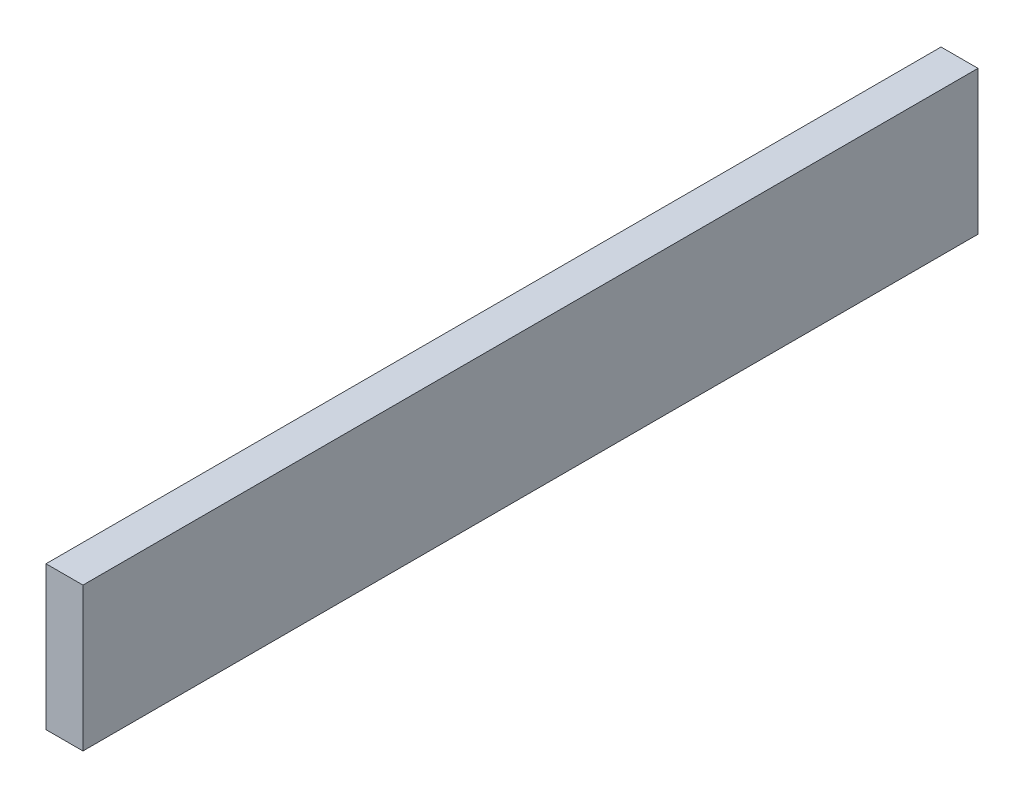
ISO-10303-21;
HEADER;
FILE_DESCRIPTION(('STEP AP214'),'2;1');
FILE_NAME('part.step','',(''),(''),'','','');
FILE_SCHEMA(('AUTOMOTIVE_DESIGN { 1 0 10303 214 1 1 1 1 }'));
ENDSEC;
DATA;
#1=APPLICATION_CONTEXT('core data for automotive mechanical design processes');
#2=APPLICATION_PROTOCOL_DEFINITION('international standard','automotive_design',2000,#1);
#3=PRODUCT_CONTEXT('',#1,'mechanical');
#4=PRODUCT('Part','Part','',(#3));
#5=PRODUCT_RELATED_PRODUCT_CATEGORY('part','',(#4));
#6=PRODUCT_DEFINITION_FORMATION('','',#4);
#7=PRODUCT_DEFINITION_CONTEXT('part definition',#1,'design');
#8=PRODUCT_DEFINITION('design','',#6,#7);
#9=PRODUCT_DEFINITION_SHAPE('','',#8);
#10=(LENGTH_UNIT() NAMED_UNIT(*) SI_UNIT(.MILLI.,.METRE.));
#11=(NAMED_UNIT(*) PLANE_ANGLE_UNIT() SI_UNIT($,.RADIAN.));
#12=(NAMED_UNIT(*) SI_UNIT($,.STERADIAN.) SOLID_ANGLE_UNIT());
#13=UNCERTAINTY_MEASURE_WITH_UNIT(LENGTH_MEASURE(1.E-05),#10,'distance_accuracy_value','');
#14=(GEOMETRIC_REPRESENTATION_CONTEXT(3) GLOBAL_UNCERTAINTY_ASSIGNED_CONTEXT((#13)) GLOBAL_UNIT_ASSIGNED_CONTEXT((#10,
#11,#12)) REPRESENTATION_CONTEXT('',''));
#15=CARTESIAN_POINT('',(0.,0.,0.));
#16=DIRECTION('',(0.,0.,1.));
#17=DIRECTION('',(1.,0.,0.));
#18=AXIS2_PLACEMENT_3D('',#15,#16,#17);
#19=CARTESIAN_POINT('',(18.,0.,0.));
#20=DIRECTION('',(0.,0.,-1.));
#21=DIRECTION('',(-1.,0.,0.));
#22=AXIS2_PLACEMENT_3D('',#19,#20,#21);
#23=PLANE('',#22);
#24=DIRECTION('',(0.,-1.,0.));
#25=VECTOR('',#24,1.);
#26=CARTESIAN_POINT('',(0.,0.,0.));
#27=LINE('',#26,#25);
#28=CARTESIAN_POINT('',(0.,70.,0.));
#29=VERTEX_POINT('',#28);
#30=CARTESIAN_POINT('',(0.,0.,0.));
#31=VERTEX_POINT('',#30);
#32=EDGE_CURVE('E96',#29,#31,#27,.T.);
#33=ORIENTED_EDGE('',*,*,#32,.T.);
#34=DIRECTION('',(-1.,0.,0.));
#35=VECTOR('',#34,1.);
#36=CARTESIAN_POINT('',(18.,0.,0.));
#37=LINE('',#36,#35);
#38=CARTESIAN_POINT('',(18.,0.,0.));
#39=VERTEX_POINT('',#38);
#40=EDGE_CURVE('E11',#39,#31,#37,.T.);
#41=ORIENTED_EDGE('',*,*,#40,.F.);
#42=DIRECTION('',(0.,-1.,0.));
#43=VECTOR('',#42,1.);
#44=CARTESIAN_POINT('',(18.,0.,0.));
#45=LINE('',#44,#43);
#46=CARTESIAN_POINT('',(18.,70.,0.));
#47=VERTEX_POINT('',#46);
#48=EDGE_CURVE('E84',#47,#39,#45,.T.);
#49=ORIENTED_EDGE('',*,*,#48,.F.);
#50=DIRECTION('',(-1.,0.,0.));
#51=VECTOR('',#50,1.);
#52=CARTESIAN_POINT('',(18.,70.,0.));
#53=LINE('',#52,#51);
#54=EDGE_CURVE('E92',#47,#29,#53,.T.);
#55=ORIENTED_EDGE('',*,*,#54,.T.);
#56=EDGE_LOOP('',(#33,#41,#49,#55));
#57=FACE_BOUND('',#56,.T.);
#58=ADVANCED_FACE('F33',(#57),#23,.F.);
#59=CARTESIAN_POINT('',(18.,0.,0.));
#60=DIRECTION('',(0.,1.,0.));
#61=DIRECTION('',(0.,0.,1.));
#62=AXIS2_PLACEMENT_3D('',#59,#60,#61);
#63=PLANE('',#62);
#64=DIRECTION('',(0.,0.,-1.));
#65=VECTOR('',#64,1.);
#66=CARTESIAN_POINT('',(0.,0.,0.));
#67=LINE('',#66,#65);
#68=CARTESIAN_POINT('',(0.,0.,-436.));
#69=VERTEX_POINT('',#68);
#70=EDGE_CURVE('E88',#31,#69,#67,.T.);
#71=ORIENTED_EDGE('',*,*,#70,.T.);
#72=DIRECTION('',(-1.,0.,0.));
#73=VECTOR('',#72,1.);
#74=CARTESIAN_POINT('',(18.,0.,-436.));
#75=LINE('',#74,#73);
#76=CARTESIAN_POINT('',(18.,0.,-436.));
#77=VERTEX_POINT('',#76);
#78=EDGE_CURVE('E41',#77,#69,#75,.T.);
#79=ORIENTED_EDGE('',*,*,#78,.F.);
#80=DIRECTION('',(0.,0.,-1.));
#81=VECTOR('',#80,1.);
#82=CARTESIAN_POINT('',(18.,0.,0.));
#83=LINE('',#82,#81);
#84=EDGE_CURVE('E79',#39,#77,#83,.T.);
#85=ORIENTED_EDGE('',*,*,#84,.F.);
#86=ORIENTED_EDGE('',*,*,#40,.T.);
#87=EDGE_LOOP('',(#71,#79,#85,#86));
#88=FACE_BOUND('',#87,.T.);
#89=ADVANCED_FACE('F87',(#88),#63,.F.);
#90=CARTESIAN_POINT('',(18.,0.,-436.));
#91=DIRECTION('',(0.,0.,1.));
#92=DIRECTION('',(1.,0.,0.));
#93=AXIS2_PLACEMENT_3D('',#90,#91,#92);
#94=PLANE('',#93);
#95=DIRECTION('',(0.,1.,0.));
#96=VECTOR('',#95,1.);
#97=CARTESIAN_POINT('',(0.,0.,-436.));
#98=LINE('',#97,#96);
#99=CARTESIAN_POINT('',(0.,70.,-436.));
#100=VERTEX_POINT('',#99);
#101=EDGE_CURVE('E66',#69,#100,#98,.T.);
#102=ORIENTED_EDGE('',*,*,#101,.T.);
#103=DIRECTION('',(-1.,0.,0.));
#104=VECTOR('',#103,1.);
#105=CARTESIAN_POINT('',(18.,70.,-436.));
#106=LINE('',#105,#104);
#107=CARTESIAN_POINT('',(18.,70.,-436.));
#108=VERTEX_POINT('',#107);
#109=EDGE_CURVE('E89',#108,#100,#106,.T.);
#110=ORIENTED_EDGE('',*,*,#109,.F.);
#111=DIRECTION('',(0.,1.,0.));
#112=VECTOR('',#111,1.);
#113=CARTESIAN_POINT('',(18.,0.,-436.));
#114=LINE('',#113,#112);
#115=EDGE_CURVE('E82',#77,#108,#114,.T.);
#116=ORIENTED_EDGE('',*,*,#115,.F.);
#117=ORIENTED_EDGE('',*,*,#78,.T.);
#118=EDGE_LOOP('',(#102,#110,#116,#117));
#119=FACE_BOUND('',#118,.T.);
#120=ADVANCED_FACE('F90',(#119),#94,.F.);
#121=CARTESIAN_POINT('',(18.,70.,0.));
#122=DIRECTION('',(0.,-1.,0.));
#123=DIRECTION('',(0.,0.,-1.));
#124=AXIS2_PLACEMENT_3D('',#121,#122,#123);
#125=PLANE('',#124);
#126=DIRECTION('',(0.,0.,1.));
#127=VECTOR('',#126,1.);
#128=CARTESIAN_POINT('',(0.,70.,0.));
#129=LINE('',#128,#127);
#130=EDGE_CURVE('E72',#100,#29,#129,.T.);
#131=ORIENTED_EDGE('',*,*,#130,.T.);
#132=ORIENTED_EDGE('',*,*,#54,.F.);
#133=DIRECTION('',(0.,0.,1.));
#134=VECTOR('',#133,1.);
#135=CARTESIAN_POINT('',(18.,70.,0.));
#136=LINE('',#135,#134);
#137=EDGE_CURVE('E49',#108,#47,#136,.T.);
#138=ORIENTED_EDGE('',*,*,#137,.F.);
#139=ORIENTED_EDGE('',*,*,#109,.T.);
#140=EDGE_LOOP('',(#131,#132,#138,#139));
#141=FACE_BOUND('',#140,.T.);
#142=ADVANCED_FACE('F103',(#141),#125,.F.);
#143=CARTESIAN_POINT('',(18.,0.,0.));
#144=DIRECTION('',(-1.,0.,0.));
#145=DIRECTION('',(0.,0.,1.));
#146=AXIS2_PLACEMENT_3D('',#143,#144,#145);
#147=PLANE('',#146);
#148=ORIENTED_EDGE('',*,*,#48,.T.);
#149=ORIENTED_EDGE('',*,*,#84,.T.);
#150=ORIENTED_EDGE('',*,*,#115,.T.);
#151=ORIENTED_EDGE('',*,*,#137,.T.);
#152=EDGE_LOOP('',(#148,#149,#150,#151));
#153=FACE_BOUND('',#152,.T.);
#154=ADVANCED_FACE('F80',(#153),#147,.F.);
#155=CARTESIAN_POINT('',(0.,0.,0.));
#156=DIRECTION('',(-1.,0.,0.));
#157=DIRECTION('',(0.,0.,1.));
#158=AXIS2_PLACEMENT_3D('',#155,#156,#157);
#159=PLANE('',#158);
#160=ORIENTED_EDGE('',*,*,#32,.F.);
#161=ORIENTED_EDGE('',*,*,#130,.F.);
#162=ORIENTED_EDGE('',*,*,#101,.F.);
#163=ORIENTED_EDGE('',*,*,#70,.F.);
#164=EDGE_LOOP('',(#160,#161,#162,#163));
#165=FACE_BOUND('',#164,.T.);
#166=ADVANCED_FACE('F106',(#165),#159,.T.);
#167=CLOSED_SHELL('',(#58,#89,#120,#142,#154,#166));
#168=MANIFOLD_SOLID_BREP('B2',#167);
#169=ADVANCED_BREP_SHAPE_REPRESENTATION('',(#18,#168),#14);
#170=SHAPE_DEFINITION_REPRESENTATION(#9,#169);
ENDSEC;
END-ISO-10303-21;
